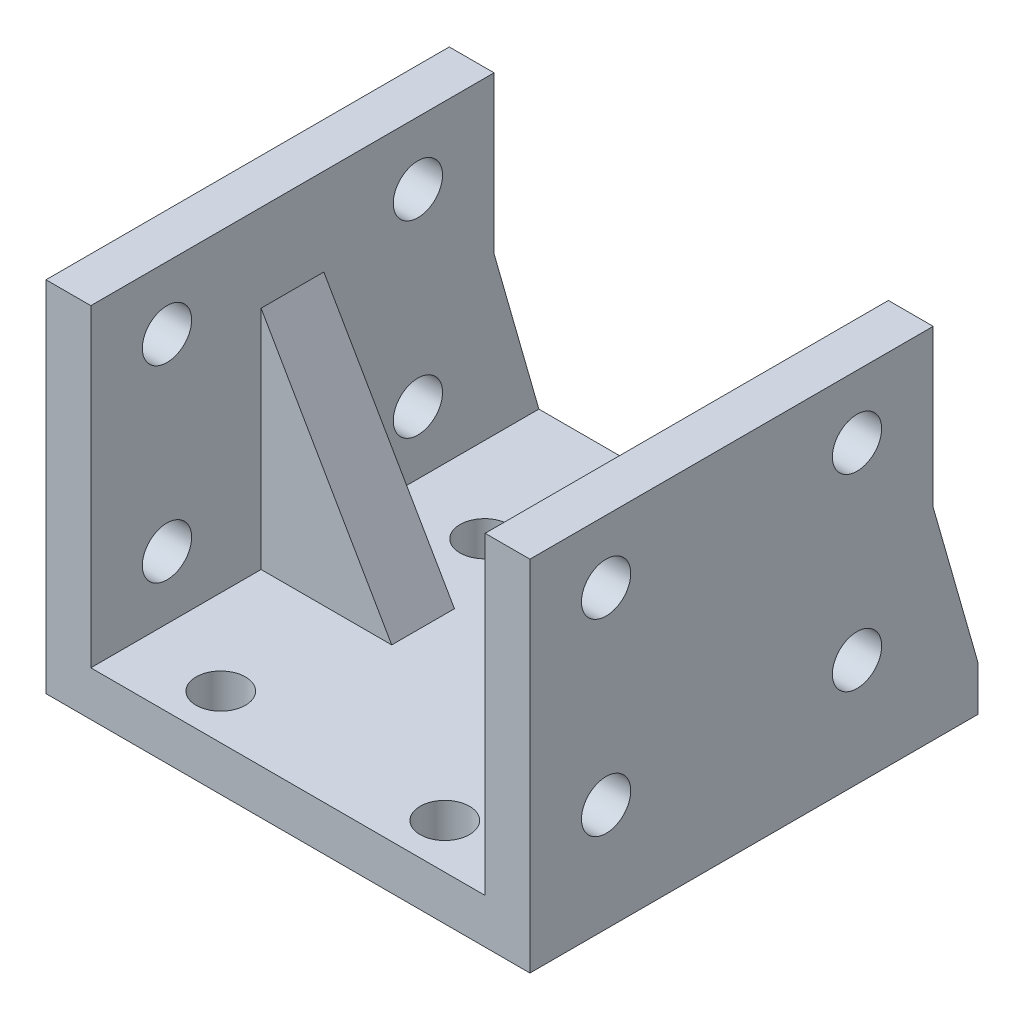
ISO-10303-21;
HEADER;
FILE_DESCRIPTION(('STEP AP214'),'2;1');
FILE_NAME('part.step','',(''),(''),'','','');
FILE_SCHEMA(('AUTOMOTIVE_DESIGN { 1 0 10303 214 1 1 1 1 }'));
ENDSEC;
DATA;
#1=APPLICATION_CONTEXT('core data for automotive mechanical design processes');
#2=APPLICATION_PROTOCOL_DEFINITION('international standard','automotive_design',2000,#1);
#3=PRODUCT_CONTEXT('',#1,'mechanical');
#4=PRODUCT('Part','Part','',(#3));
#5=PRODUCT_RELATED_PRODUCT_CATEGORY('part','',(#4));
#6=PRODUCT_DEFINITION_FORMATION('','',#4);
#7=PRODUCT_DEFINITION_CONTEXT('part definition',#1,'design');
#8=PRODUCT_DEFINITION('design','',#6,#7);
#9=PRODUCT_DEFINITION_SHAPE('','',#8);
#10=(LENGTH_UNIT() NAMED_UNIT(*) SI_UNIT(.MILLI.,.METRE.));
#11=(NAMED_UNIT(*) PLANE_ANGLE_UNIT() SI_UNIT($,.RADIAN.));
#12=(NAMED_UNIT(*) SI_UNIT($,.STERADIAN.) SOLID_ANGLE_UNIT());
#13=UNCERTAINTY_MEASURE_WITH_UNIT(LENGTH_MEASURE(1.E-05),#10,'distance_accuracy_value','');
#14=(GEOMETRIC_REPRESENTATION_CONTEXT(3) GLOBAL_UNCERTAINTY_ASSIGNED_CONTEXT((#13)) GLOBAL_UNIT_ASSIGNED_CONTEXT((#10,
#11,#12)) REPRESENTATION_CONTEXT('',''));
#15=CARTESIAN_POINT('',(0.,0.,0.));
#16=DIRECTION('',(0.,0.,1.));
#17=DIRECTION('',(1.,0.,0.));
#18=AXIS2_PLACEMENT_3D('',#15,#16,#17);
#19=CARTESIAN_POINT('',(0.,5.,0.));
#20=DIRECTION('',(0.,1.,0.));
#21=DIRECTION('',(0.,0.,1.));
#22=AXIS2_PLACEMENT_3D('',#19,#20,#21);
#23=PLANE('',#22);
#24=DIRECTION('',(-1.,0.,0.));
#25=VECTOR('',#24,1.);
#26=CARTESIAN_POINT('',(0.,5.,22.5));
#27=LINE('',#26,#25);
#28=CARTESIAN_POINT('',(22.,4.99999999999998,22.5));
#29=VERTEX_POINT('',#28);
#30=CARTESIAN_POINT('',(-22.,5.,22.5));
#31=VERTEX_POINT('',#30);
#32=EDGE_CURVE('E180',#29,#31,#27,.T.);
#33=ORIENTED_EDGE('',*,*,#32,.F.);
#34=DIRECTION('',(0.,0.,-1.));
#35=VECTOR('',#34,1.);
#36=CARTESIAN_POINT('',(22.,5.,-22.5));
#37=LINE('',#36,#35);
#38=CARTESIAN_POINT('',(22.,4.99999999999998,3.5));
#39=VERTEX_POINT('',#38);
#40=EDGE_CURVE('E315',#29,#39,#37,.T.);
#41=ORIENTED_EDGE('',*,*,#40,.T.);
#42=DIRECTION('',(1.,0.,0.));
#43=VECTOR('',#42,1.);
#44=CARTESIAN_POINT('',(0.,5.,3.5));
#45=LINE('',#44,#43);
#46=CARTESIAN_POINT('',(7.42190570296203,5.,3.5));
#47=VERTEX_POINT('',#46);
#48=EDGE_CURVE('E243',#47,#39,#45,.T.);
#49=ORIENTED_EDGE('',*,*,#48,.F.);
#50=DIRECTION('',(0.,0.,1.));
#51=VECTOR('',#50,1.);
#52=CARTESIAN_POINT('',(7.42190570296203,5.,0.));
#53=LINE('',#52,#51);
#54=CARTESIAN_POINT('',(7.42190570296203,5.,-3.5));
#55=VERTEX_POINT('',#54);
#56=EDGE_CURVE('E241',#55,#47,#53,.T.);
#57=ORIENTED_EDGE('',*,*,#56,.F.);
#58=DIRECTION('',(1.,0.,0.));
#59=VECTOR('',#58,1.);
#60=CARTESIAN_POINT('',(0.,5.,-3.5));
#61=LINE('',#60,#59);
#62=CARTESIAN_POINT('',(22.,4.99999999999998,-3.5));
#63=VERTEX_POINT('',#62);
#64=EDGE_CURVE('E236',#55,#63,#61,.T.);
#65=ORIENTED_EDGE('',*,*,#64,.T.);
#66=CARTESIAN_POINT('',(22.,4.99999999999998,-27.5));
#67=VERTEX_POINT('',#66);
#68=EDGE_CURVE('E233',#63,#67,#37,.T.);
#69=ORIENTED_EDGE('',*,*,#68,.T.);
#70=DIRECTION('',(-1.,0.,0.));
#71=VECTOR('',#70,1.);
#72=CARTESIAN_POINT('',(-27.,5.,-27.5));
#73=LINE('',#72,#71);
#74=CARTESIAN_POINT('',(-22.,5.,-27.5));
#75=VERTEX_POINT('',#74);
#76=EDGE_CURVE('E188',#67,#75,#73,.T.);
#77=ORIENTED_EDGE('',*,*,#76,.T.);
#78=DIRECTION('',(0.,0.,-1.));
#79=VECTOR('',#78,1.);
#80=CARTESIAN_POINT('',(-22.,5.,-22.5));
#81=LINE('',#80,#79);
#82=CARTESIAN_POINT('',(-22.,5.,-3.50000000000001));
#83=VERTEX_POINT('',#82);
#84=EDGE_CURVE('E385',#83,#75,#81,.T.);
#85=ORIENTED_EDGE('',*,*,#84,.F.);
#86=DIRECTION('',(1.,0.,0.));
#87=VECTOR('',#86,1.);
#88=CARTESIAN_POINT('',(0.,5.,-3.5));
#89=LINE('',#88,#87);
#90=CARTESIAN_POINT('',(-7.42190570296203,5.,-3.5));
#91=VERTEX_POINT('',#90);
#92=EDGE_CURVE('E259',#83,#91,#89,.T.);
#93=ORIENTED_EDGE('',*,*,#92,.T.);
#94=DIRECTION('',(0.,0.,1.));
#95=VECTOR('',#94,1.);
#96=CARTESIAN_POINT('',(-7.42190570296203,5.,0.));
#97=LINE('',#96,#95);
#98=CARTESIAN_POINT('',(-7.42190570296203,5.,3.5));
#99=VERTEX_POINT('',#98);
#100=EDGE_CURVE('E62',#99,#91,#97,.F.);
#101=ORIENTED_EDGE('',*,*,#100,.F.);
#102=DIRECTION('',(1.,0.,0.));
#103=VECTOR('',#102,1.);
#104=CARTESIAN_POINT('',(0.,5.,3.5));
#105=LINE('',#104,#103);
#106=CARTESIAN_POINT('',(-22.,5.,3.49999999999999));
#107=VERTEX_POINT('',#106);
#108=EDGE_CURVE('E265',#107,#99,#105,.T.);
#109=ORIENTED_EDGE('',*,*,#108,.F.);
#110=EDGE_CURVE('E392',#31,#107,#81,.T.);
#111=ORIENTED_EDGE('',*,*,#110,.F.);
#112=EDGE_LOOP('',(#33,#41,#49,#57,#65,#69,#77,#85,#93,#101,#109,#111));
#113=FACE_BOUND('',#112,.T.);
#114=CARTESIAN_POINT('',(-12.5,5.,-11.9432112265549));
#115=DIRECTION('',(0.,1.,0.));
#116=DIRECTION('',(0.,0.,1.));
#117=AXIS2_PLACEMENT_3D('',#114,#115,#116);
#118=CIRCLE('',#117,2.75);
#119=CARTESIAN_POINT('',(-12.5,5.,-9.19321122655494));
#120=VERTEX_POINT('',#119);
#121=EDGE_CURVE('E437',#120,#120,#118,.T.);
#122=ORIENTED_EDGE('',*,*,#121,.F.);
#123=EDGE_LOOP('',(#122));
#124=FACE_BOUND('',#123,.T.);
#125=CARTESIAN_POINT('',(-12.5,5.,17.5));
#126=DIRECTION('',(0.,1.,0.));
#127=DIRECTION('',(0.,0.,1.));
#128=AXIS2_PLACEMENT_3D('',#125,#126,#127);
#129=CIRCLE('',#128,2.75);
#130=CARTESIAN_POINT('',(-12.5,5.,20.25));
#131=VERTEX_POINT('',#130);
#132=EDGE_CURVE('E772',#131,#131,#129,.T.);
#133=ORIENTED_EDGE('',*,*,#132,.F.);
#134=EDGE_LOOP('',(#133));
#135=FACE_BOUND('',#134,.T.);
#136=CARTESIAN_POINT('',(12.5,5.,17.5));
#137=DIRECTION('',(0.,1.,0.));
#138=DIRECTION('',(0.,0.,1.));
#139=AXIS2_PLACEMENT_3D('',#136,#137,#138);
#140=CIRCLE('',#139,2.75);
#141=CARTESIAN_POINT('',(12.5,5.,20.25));
#142=VERTEX_POINT('',#141);
#143=EDGE_CURVE('E788',#142,#142,#140,.T.);
#144=ORIENTED_EDGE('',*,*,#143,.F.);
#145=EDGE_LOOP('',(#144));
#146=FACE_BOUND('',#145,.T.);
#147=CARTESIAN_POINT('',(12.5,5.,-11.9432112265549));
#148=DIRECTION('',(0.,1.,0.));
#149=DIRECTION('',(0.,0.,1.));
#150=AXIS2_PLACEMENT_3D('',#147,#148,#149);
#151=CIRCLE('',#150,2.75);
#152=CARTESIAN_POINT('',(12.5,5.,-9.19321122655494));
#153=VERTEX_POINT('',#152);
#154=EDGE_CURVE('E780',#153,#153,#151,.T.);
#155=ORIENTED_EDGE('',*,*,#154,.F.);
#156=EDGE_LOOP('',(#155));
#157=FACE_BOUND('',#156,.T.);
#158=ADVANCED_FACE('F38',(#113,#124,#135,#146,#157),#23,.T.);
#159=CARTESIAN_POINT('',(27.,5.,-27.5));
#160=DIRECTION('',(-1.,0.,0.));
#161=DIRECTION('',(0.,0.,1.));
#162=AXIS2_PLACEMENT_3D('',#159,#160,#161);
#163=PLANE('',#162);
#164=DIRECTION('',(0.,-1.,0.));
#165=VECTOR('',#164,1.);
#166=CARTESIAN_POINT('',(27.,40.,22.5));
#167=LINE('',#166,#165);
#168=CARTESIAN_POINT('',(27.,40.,22.5));
#169=VERTEX_POINT('',#168);
#170=CARTESIAN_POINT('',(27.,0.,22.5));
#171=VERTEX_POINT('',#170);
#172=EDGE_CURVE('E326',#169,#171,#167,.T.);
#173=ORIENTED_EDGE('',*,*,#172,.T.);
#174=DIRECTION('',(0.,0.,-1.));
#175=VECTOR('',#174,1.);
#176=CARTESIAN_POINT('',(27.,0.,-27.5));
#177=LINE('',#176,#175);
#178=CARTESIAN_POINT('',(27.,0.,-27.5));
#179=VERTEX_POINT('',#178);
#180=EDGE_CURVE('E171',#171,#179,#177,.T.);
#181=ORIENTED_EDGE('',*,*,#180,.T.);
#182=DIRECTION('',(0.,-1.,0.));
#183=VECTOR('',#182,1.);
#184=CARTESIAN_POINT('',(27.,5.,-27.5));
#185=LINE('',#184,#183);
#186=CARTESIAN_POINT('',(27.,4.99999999999998,-27.5));
#187=VERTEX_POINT('',#186);
#188=EDGE_CURVE('E201',#187,#179,#185,.T.);
#189=ORIENTED_EDGE('',*,*,#188,.F.);
#190=DIRECTION('',(0.,-0.961523947640823,-0.274721127897378));
#191=VECTOR('',#190,1.);
#192=CARTESIAN_POINT('',(27.,22.5,-22.5));
#193=LINE('',#192,#191);
#194=CARTESIAN_POINT('',(27.,22.5,-22.5));
#195=VERTEX_POINT('',#194);
#196=EDGE_CURVE('E271',#195,#187,#193,.T.);
#197=ORIENTED_EDGE('',*,*,#196,.F.);
#198=DIRECTION('',(0.,-1.,0.));
#199=VECTOR('',#198,1.);
#200=CARTESIAN_POINT('',(27.,40.,-22.5));
#201=LINE('',#200,#199);
#202=CARTESIAN_POINT('',(27.,40.,-22.5));
#203=VERTEX_POINT('',#202);
#204=EDGE_CURVE('E338',#203,#195,#201,.T.);
#205=ORIENTED_EDGE('',*,*,#204,.F.);
#206=DIRECTION('',(0.,0.,1.));
#207=VECTOR('',#206,1.);
#208=CARTESIAN_POINT('',(27.,40.,-22.5));
#209=LINE('',#208,#207);
#210=EDGE_CURVE('E311',#203,#169,#209,.T.);
#211=ORIENTED_EDGE('',*,*,#210,.T.);
#212=EDGE_LOOP('',(#173,#181,#189,#197,#205,#211));
#213=FACE_BOUND('',#212,.T.);
#214=CARTESIAN_POINT('',(27.,33.,14.));
#215=DIRECTION('',(1.,0.,0.));
#216=DIRECTION('',(0.,0.,-1.));
#217=AXIS2_PLACEMENT_3D('',#214,#215,#216);
#218=CIRCLE('',#217,2.75);
#219=CARTESIAN_POINT('',(27.,33.,11.25));
#220=VERTEX_POINT('',#219);
#221=EDGE_CURVE('E304',#220,#220,#218,.T.);
#222=ORIENTED_EDGE('',*,*,#221,.F.);
#223=EDGE_LOOP('',(#222));
#224=FACE_BOUND('',#223,.T.);
#225=CARTESIAN_POINT('',(27.,33.,-14.));
#226=DIRECTION('',(1.,0.,0.));
#227=DIRECTION('',(0.,0.,-1.));
#228=AXIS2_PLACEMENT_3D('',#225,#226,#227);
#229=CIRCLE('',#228,2.75);
#230=CARTESIAN_POINT('',(27.,33.,-16.75));
#231=VERTEX_POINT('',#230);
#232=EDGE_CURVE('E280',#231,#231,#229,.T.);
#233=ORIENTED_EDGE('',*,*,#232,.F.);
#234=EDGE_LOOP('',(#233));
#235=FACE_BOUND('',#234,.T.);
#236=CARTESIAN_POINT('',(27.,12.,-14.));
#237=DIRECTION('',(1.,0.,0.));
#238=DIRECTION('',(0.,0.,-1.));
#239=AXIS2_PLACEMENT_3D('',#236,#237,#238);
#240=CIRCLE('',#239,2.75);
#241=CARTESIAN_POINT('',(27.,12.,-16.75));
#242=VERTEX_POINT('',#241);
#243=EDGE_CURVE('E289',#242,#242,#240,.T.);
#244=ORIENTED_EDGE('',*,*,#243,.F.);
#245=EDGE_LOOP('',(#244));
#246=FACE_BOUND('',#245,.T.);
#247=CARTESIAN_POINT('',(27.,12.,14.));
#248=DIRECTION('',(1.,0.,0.));
#249=DIRECTION('',(0.,0.,-1.));
#250=AXIS2_PLACEMENT_3D('',#247,#248,#249);
#251=CIRCLE('',#250,2.75);
#252=CARTESIAN_POINT('',(27.,12.,11.25));
#253=VERTEX_POINT('',#252);
#254=EDGE_CURVE('E297',#253,#253,#251,.T.);
#255=ORIENTED_EDGE('',*,*,#254,.F.);
#256=EDGE_LOOP('',(#255));
#257=FACE_BOUND('',#256,.T.);
#258=ADVANCED_FACE('F40',(#213,#224,#235,#246,#257),#163,.F.);
#259=CARTESIAN_POINT('',(-27.,5.,-27.5));
#260=DIRECTION('',(0.,0.,1.));
#261=DIRECTION('',(1.,0.,0.));
#262=AXIS2_PLACEMENT_3D('',#259,#260,#261);
#263=PLANE('',#262);
#264=DIRECTION('',(-1.,0.,0.));
#265=VECTOR('',#264,1.);
#266=CARTESIAN_POINT('',(-27.,0.,-27.5));
#267=LINE('',#266,#265);
#268=CARTESIAN_POINT('',(-27.,0.,-27.5));
#269=VERTEX_POINT('',#268);
#270=EDGE_CURVE('E189',#179,#269,#267,.T.);
#271=ORIENTED_EDGE('',*,*,#270,.T.);
#272=DIRECTION('',(0.,-1.,0.));
#273=VECTOR('',#272,1.);
#274=CARTESIAN_POINT('',(-27.,5.,-27.5));
#275=LINE('',#274,#273);
#276=CARTESIAN_POINT('',(-27.,5.,-27.5));
#277=VERTEX_POINT('',#276);
#278=EDGE_CURVE('E186',#277,#269,#275,.T.);
#279=ORIENTED_EDGE('',*,*,#278,.F.);
#280=DIRECTION('',(-1.,0.,0.));
#281=VECTOR('',#280,1.);
#282=CARTESIAN_POINT('',(0.,5.,-27.5));
#283=LINE('',#282,#281);
#284=EDGE_CURVE('E352',#75,#277,#283,.T.);
#285=ORIENTED_EDGE('',*,*,#284,.F.);
#286=ORIENTED_EDGE('',*,*,#76,.F.);
#287=EDGE_CURVE('E194',#187,#67,#73,.T.);
#288=ORIENTED_EDGE('',*,*,#287,.F.);
#289=ORIENTED_EDGE('',*,*,#188,.T.);
#290=EDGE_LOOP('',(#271,#279,#285,#286,#288,#289));
#291=FACE_BOUND('',#290,.T.);
#292=ADVANCED_FACE('F419',(#291),#263,.F.);
#293=CARTESIAN_POINT('',(-27.,5.,-27.5));
#294=DIRECTION('',(1.,0.,0.));
#295=DIRECTION('',(0.,0.,-1.));
#296=AXIS2_PLACEMENT_3D('',#293,#294,#295);
#297=PLANE('',#296);
#298=DIRECTION('',(0.,0.,1.));
#299=VECTOR('',#298,1.);
#300=CARTESIAN_POINT('',(-27.,0.,-27.5));
#301=LINE('',#300,#299);
#302=CARTESIAN_POINT('',(-27.,0.,22.5));
#303=VERTEX_POINT('',#302);
#304=EDGE_CURVE('E178',#269,#303,#301,.T.);
#305=ORIENTED_EDGE('',*,*,#304,.T.);
#306=DIRECTION('',(0.,-1.,0.));
#307=VECTOR('',#306,1.);
#308=CARTESIAN_POINT('',(-27.,40.,22.5));
#309=LINE('',#308,#307);
#310=CARTESIAN_POINT('',(-27.,40.,22.5));
#311=VERTEX_POINT('',#310);
#312=EDGE_CURVE('E159',#311,#303,#309,.T.);
#313=ORIENTED_EDGE('',*,*,#312,.F.);
#314=DIRECTION('',(0.,0.,1.));
#315=VECTOR('',#314,1.);
#316=CARTESIAN_POINT('',(-27.,40.,-22.5));
#317=LINE('',#316,#315);
#318=CARTESIAN_POINT('',(-27.,40.,-22.5));
#319=VERTEX_POINT('',#318);
#320=EDGE_CURVE('E389',#319,#311,#317,.T.);
#321=ORIENTED_EDGE('',*,*,#320,.F.);
#322=DIRECTION('',(0.,-1.,0.));
#323=VECTOR('',#322,1.);
#324=CARTESIAN_POINT('',(-27.,40.,-22.5));
#325=LINE('',#324,#323);
#326=CARTESIAN_POINT('',(-27.,22.5,-22.5));
#327=VERTEX_POINT('',#326);
#328=EDGE_CURVE('E401',#319,#327,#325,.T.);
#329=ORIENTED_EDGE('',*,*,#328,.T.);
#330=DIRECTION('',(0.,-0.961523947640823,-0.274721127897378));
#331=VECTOR('',#330,1.);
#332=CARTESIAN_POINT('',(-27.,22.5,-22.5));
#333=LINE('',#332,#331);
#334=EDGE_CURVE('E343',#327,#277,#333,.T.);
#335=ORIENTED_EDGE('',*,*,#334,.T.);
#336=ORIENTED_EDGE('',*,*,#278,.T.);
#337=EDGE_LOOP('',(#305,#313,#321,#329,#335,#336));
#338=FACE_BOUND('',#337,.T.);
#339=CARTESIAN_POINT('',(-27.,33.,14.));
#340=DIRECTION('',(1.,0.,0.));
#341=DIRECTION('',(0.,0.,-1.));
#342=AXIS2_PLACEMENT_3D('',#339,#340,#341);
#343=CIRCLE('',#342,2.75);
#344=CARTESIAN_POINT('',(-27.,33.,11.25));
#345=VERTEX_POINT('',#344);
#346=EDGE_CURVE('E381',#345,#345,#343,.T.);
#347=ORIENTED_EDGE('',*,*,#346,.T.);
#348=EDGE_LOOP('',(#347));
#349=FACE_BOUND('',#348,.T.);
#350=CARTESIAN_POINT('',(-27.,33.,-14.));
#351=DIRECTION('',(1.,0.,0.));
#352=DIRECTION('',(0.,0.,-1.));
#353=AXIS2_PLACEMENT_3D('',#350,#351,#352);
#354=CIRCLE('',#353,2.75);
#355=CARTESIAN_POINT('',(-27.,33.,-16.75));
#356=VERTEX_POINT('',#355);
#357=EDGE_CURVE('E357',#356,#356,#354,.T.);
#358=ORIENTED_EDGE('',*,*,#357,.T.);
#359=EDGE_LOOP('',(#358));
#360=FACE_BOUND('',#359,.T.);
#361=CARTESIAN_POINT('',(-27.,12.,-14.));
#362=DIRECTION('',(1.,0.,0.));
#363=DIRECTION('',(0.,0.,-1.));
#364=AXIS2_PLACEMENT_3D('',#361,#362,#363);
#365=CIRCLE('',#364,2.75);
#366=CARTESIAN_POINT('',(-27.,12.,-16.75));
#367=VERTEX_POINT('',#366);
#368=EDGE_CURVE('E366',#367,#367,#365,.T.);
#369=ORIENTED_EDGE('',*,*,#368,.T.);
#370=EDGE_LOOP('',(#369));
#371=FACE_BOUND('',#370,.T.);
#372=CARTESIAN_POINT('',(-27.,12.,14.));
#373=DIRECTION('',(1.,0.,0.));
#374=DIRECTION('',(0.,0.,-1.));
#375=AXIS2_PLACEMENT_3D('',#372,#373,#374);
#376=CIRCLE('',#375,2.75);
#377=CARTESIAN_POINT('',(-27.,12.,11.25));
#378=VERTEX_POINT('',#377);
#379=EDGE_CURVE('E374',#378,#378,#376,.T.);
#380=ORIENTED_EDGE('',*,*,#379,.T.);
#381=EDGE_LOOP('',(#380));
#382=FACE_BOUND('',#381,.T.);
#383=ADVANCED_FACE('F183',(#338,#349,#360,#371,#382),#297,.F.);
#384=CARTESIAN_POINT('',(0.,0.,0.));
#385=DIRECTION('',(0.,1.,0.));
#386=DIRECTION('',(0.,0.,1.));
#387=AXIS2_PLACEMENT_3D('',#384,#385,#386);
#388=PLANE('',#387);
#389=CARTESIAN_POINT('',(-12.5,0.,-11.9432112265549));
#390=DIRECTION('',(0.,1.,0.));
#391=DIRECTION('',(0.,0.,1.));
#392=AXIS2_PLACEMENT_3D('',#389,#390,#391);
#393=CIRCLE('',#392,2.75);
#394=CARTESIAN_POINT('',(-12.5,0.,-9.19321122655494));
#395=VERTEX_POINT('',#394);
#396=EDGE_CURVE('E766',#395,#395,#393,.T.);
#397=ORIENTED_EDGE('',*,*,#396,.T.);
#398=EDGE_LOOP('',(#397));
#399=FACE_BOUND('',#398,.T.);
#400=CARTESIAN_POINT('',(-12.5,0.,17.5));
#401=DIRECTION('',(0.,1.,0.));
#402=DIRECTION('',(0.,0.,1.));
#403=AXIS2_PLACEMENT_3D('',#400,#401,#402);
#404=CIRCLE('',#403,2.75);
#405=CARTESIAN_POINT('',(-12.5,0.,20.25));
#406=VERTEX_POINT('',#405);
#407=EDGE_CURVE('E794',#406,#406,#404,.T.);
#408=ORIENTED_EDGE('',*,*,#407,.T.);
#409=EDGE_LOOP('',(#408));
#410=FACE_BOUND('',#409,.T.);
#411=CARTESIAN_POINT('',(12.5,0.,17.5));
#412=DIRECTION('',(0.,1.,0.));
#413=DIRECTION('',(0.,0.,1.));
#414=AXIS2_PLACEMENT_3D('',#411,#412,#413);
#415=CIRCLE('',#414,2.75);
#416=CARTESIAN_POINT('',(12.5,0.,20.25));
#417=VERTEX_POINT('',#416);
#418=EDGE_CURVE('E783',#417,#417,#415,.T.);
#419=ORIENTED_EDGE('',*,*,#418,.T.);
#420=EDGE_LOOP('',(#419));
#421=FACE_BOUND('',#420,.T.);
#422=CARTESIAN_POINT('',(12.5,0.,-11.9432112265549));
#423=DIRECTION('',(0.,1.,0.));
#424=DIRECTION('',(0.,0.,1.));
#425=AXIS2_PLACEMENT_3D('',#422,#423,#424);
#426=CIRCLE('',#425,2.75);
#427=CARTESIAN_POINT('',(12.5,0.,-9.19321122655494));
#428=VERTEX_POINT('',#427);
#429=EDGE_CURVE('E776',#428,#428,#426,.T.);
#430=ORIENTED_EDGE('',*,*,#429,.T.);
#431=EDGE_LOOP('',(#430));
#432=FACE_BOUND('',#431,.T.);
#433=ORIENTED_EDGE('',*,*,#180,.F.);
#434=DIRECTION('',(1.,0.,0.));
#435=VECTOR('',#434,1.);
#436=CARTESIAN_POINT('',(-27.,0.,22.5));
#437=LINE('',#436,#435);
#438=EDGE_CURVE('E163',#303,#171,#437,.T.);
#439=ORIENTED_EDGE('',*,*,#438,.F.);
#440=ORIENTED_EDGE('',*,*,#304,.F.);
#441=ORIENTED_EDGE('',*,*,#270,.F.);
#442=EDGE_LOOP('',(#433,#439,#440,#441));
#443=FACE_BOUND('',#442,.T.);
#444=ADVANCED_FACE('F176',(#399,#410,#421,#432,#443),#388,.F.);
#445=CARTESIAN_POINT('',(-27.,40.,22.5));
#446=DIRECTION('',(0.,0.,-1.));
#447=DIRECTION('',(-1.,0.,0.));
#448=AXIS2_PLACEMENT_3D('',#445,#446,#447);
#449=PLANE('',#448);
#450=ORIENTED_EDGE('',*,*,#312,.T.);
#451=ORIENTED_EDGE('',*,*,#438,.T.);
#452=ORIENTED_EDGE('',*,*,#172,.F.);
#453=DIRECTION('',(-1.,0.,0.));
#454=VECTOR('',#453,1.);
#455=CARTESIAN_POINT('',(27.,40.,22.5));
#456=LINE('',#455,#454);
#457=CARTESIAN_POINT('',(22.,40.,22.5));
#458=VERTEX_POINT('',#457);
#459=EDGE_CURVE('E322',#169,#458,#456,.T.);
#460=ORIENTED_EDGE('',*,*,#459,.T.);
#461=DIRECTION('',(0.,-1.,0.));
#462=VECTOR('',#461,1.);
#463=CARTESIAN_POINT('',(22.,40.,22.5));
#464=LINE('',#463,#462);
#465=EDGE_CURVE('E331',#458,#29,#464,.T.);
#466=ORIENTED_EDGE('',*,*,#465,.T.);
#467=ORIENTED_EDGE('',*,*,#32,.T.);
#468=DIRECTION('',(0.,-1.,0.));
#469=VECTOR('',#468,1.);
#470=CARTESIAN_POINT('',(-22.,40.,22.5));
#471=LINE('',#470,#469);
#472=CARTESIAN_POINT('',(-22.,40.,22.5));
#473=VERTEX_POINT('',#472);
#474=EDGE_CURVE('E172',#473,#31,#471,.T.);
#475=ORIENTED_EDGE('',*,*,#474,.F.);
#476=DIRECTION('',(1.,0.,0.));
#477=VECTOR('',#476,1.);
#478=CARTESIAN_POINT('',(-27.,40.,22.5));
#479=LINE('',#478,#477);
#480=EDGE_CURVE('E166',#311,#473,#479,.T.);
#481=ORIENTED_EDGE('',*,*,#480,.F.);
#482=EDGE_LOOP('',(#450,#451,#452,#460,#466,#467,#475,#481));
#483=FACE_BOUND('',#482,.T.);
#484=ADVANCED_FACE('F161',(#483),#449,.F.);
#485=CARTESIAN_POINT('',(-22.,40.,-22.5));
#486=DIRECTION('',(-1.,0.,0.));
#487=DIRECTION('',(0.,0.,1.));
#488=AXIS2_PLACEMENT_3D('',#485,#486,#487);
#489=PLANE('',#488);
#490=ORIENTED_EDGE('',*,*,#474,.T.);
#491=ORIENTED_EDGE('',*,*,#110,.T.);
#492=DIRECTION('',(0.,1.,0.));
#493=VECTOR('',#492,1.);
#494=CARTESIAN_POINT('',(-22.,40.,3.5));
#495=LINE('',#494,#493);
#496=CARTESIAN_POINT('',(-22.,30.25,3.5));
#497=VERTEX_POINT('',#496);
#498=EDGE_CURVE('E212',#107,#497,#495,.T.);
#499=ORIENTED_EDGE('',*,*,#498,.T.);
#500=DIRECTION('',(0.,0.,1.));
#501=VECTOR('',#500,1.);
#502=CARTESIAN_POINT('',(-22.,30.25,-22.5));
#503=LINE('',#502,#501);
#504=CARTESIAN_POINT('',(-22.,30.25,-3.5));
#505=VERTEX_POINT('',#504);
#506=EDGE_CURVE('E209',#497,#505,#503,.F.);
#507=ORIENTED_EDGE('',*,*,#506,.T.);
#508=DIRECTION('',(0.,1.,0.));
#509=VECTOR('',#508,1.);
#510=CARTESIAN_POINT('',(-22.,40.,-3.5));
#511=LINE('',#510,#509);
#512=EDGE_CURVE('E205',#83,#505,#511,.T.);
#513=ORIENTED_EDGE('',*,*,#512,.F.);
#514=ORIENTED_EDGE('',*,*,#84,.T.);
#515=DIRECTION('',(0.,-0.961523947640823,-0.274721127897378));
#516=VECTOR('',#515,1.);
#517=CARTESIAN_POINT('',(-22.,22.5,-22.5));
#518=LINE('',#517,#516);
#519=CARTESIAN_POINT('',(-22.,22.5,-22.5));
#520=VERTEX_POINT('',#519);
#521=EDGE_CURVE('E342',#520,#75,#518,.T.);
#522=ORIENTED_EDGE('',*,*,#521,.F.);
#523=DIRECTION('',(0.,-1.,0.));
#524=VECTOR('',#523,1.);
#525=CARTESIAN_POINT('',(-22.,40.,-22.5));
#526=LINE('',#525,#524);
#527=CARTESIAN_POINT('',(-22.,40.,-22.5));
#528=VERTEX_POINT('',#527);
#529=EDGE_CURVE('E407',#528,#520,#526,.T.);
#530=ORIENTED_EDGE('',*,*,#529,.F.);
#531=DIRECTION('',(0.,0.,-1.));
#532=VECTOR('',#531,1.);
#533=CARTESIAN_POINT('',(-22.,40.,-22.5));
#534=LINE('',#533,#532);
#535=EDGE_CURVE('E395',#473,#528,#534,.T.);
#536=ORIENTED_EDGE('',*,*,#535,.F.);
#537=EDGE_LOOP('',(#490,#491,#499,#507,#513,#514,#522,#530,#536));
#538=FACE_BOUND('',#537,.T.);
#539=CARTESIAN_POINT('',(-22.,33.,14.));
#540=DIRECTION('',(1.,0.,0.));
#541=DIRECTION('',(0.,0.,-1.));
#542=AXIS2_PLACEMENT_3D('',#539,#540,#541);
#543=CIRCLE('',#542,2.75);
#544=CARTESIAN_POINT('',(-22.,33.,11.25));
#545=VERTEX_POINT('',#544);
#546=EDGE_CURVE('E361',#545,#545,#543,.T.);
#547=ORIENTED_EDGE('',*,*,#546,.F.);
#548=EDGE_LOOP('',(#547));
#549=FACE_BOUND('',#548,.T.);
#550=CARTESIAN_POINT('',(-22.,33.,-14.));
#551=DIRECTION('',(1.,0.,0.));
#552=DIRECTION('',(0.,0.,-1.));
#553=AXIS2_PLACEMENT_3D('',#550,#551,#552);
#554=CIRCLE('',#553,2.75);
#555=CARTESIAN_POINT('',(-22.,33.,-16.75));
#556=VERTEX_POINT('',#555);
#557=EDGE_CURVE('E362',#556,#556,#554,.T.);
#558=ORIENTED_EDGE('',*,*,#557,.F.);
#559=EDGE_LOOP('',(#558));
#560=FACE_BOUND('',#559,.T.);
#561=CARTESIAN_POINT('',(-22.,12.,-14.));
#562=DIRECTION('',(1.,0.,0.));
#563=DIRECTION('',(0.,0.,-1.));
#564=AXIS2_PLACEMENT_3D('',#561,#562,#563);
#565=CIRCLE('',#564,2.75);
#566=CARTESIAN_POINT('',(-22.,12.,-16.75));
#567=VERTEX_POINT('',#566);
#568=EDGE_CURVE('E370',#567,#567,#565,.T.);
#569=ORIENTED_EDGE('',*,*,#568,.F.);
#570=EDGE_LOOP('',(#569));
#571=FACE_BOUND('',#570,.T.);
#572=CARTESIAN_POINT('',(-22.,12.,14.));
#573=DIRECTION('',(1.,0.,0.));
#574=DIRECTION('',(0.,0.,-1.));
#575=AXIS2_PLACEMENT_3D('',#572,#573,#574);
#576=CIRCLE('',#575,2.75);
#577=CARTESIAN_POINT('',(-22.,12.,11.25));
#578=VERTEX_POINT('',#577);
#579=EDGE_CURVE('E356',#578,#578,#576,.T.);
#580=ORIENTED_EDGE('',*,*,#579,.F.);
#581=EDGE_LOOP('',(#580));
#582=FACE_BOUND('',#581,.T.);
#583=ADVANCED_FACE('F494',(#538,#549,#560,#571,#582),#489,.F.);
#584=CARTESIAN_POINT('',(-27.,40.,-22.5));
#585=DIRECTION('',(0.,0.,1.));
#586=DIRECTION('',(1.,0.,0.));
#587=AXIS2_PLACEMENT_3D('',#584,#585,#586);
#588=PLANE('',#587);
#589=ORIENTED_EDGE('',*,*,#529,.T.);
#590=DIRECTION('',(-1.,0.,0.));
#591=VECTOR('',#590,1.);
#592=CARTESIAN_POINT('',(-27.,22.5,-22.5));
#593=LINE('',#592,#591);
#594=EDGE_CURVE('E346',#520,#327,#593,.T.);
#595=ORIENTED_EDGE('',*,*,#594,.T.);
#596=ORIENTED_EDGE('',*,*,#328,.F.);
#597=DIRECTION('',(-1.,0.,0.));
#598=VECTOR('',#597,1.);
#599=CARTESIAN_POINT('',(-27.,40.,-22.5));
#600=LINE('',#599,#598);
#601=EDGE_CURVE('E398',#528,#319,#600,.T.);
#602=ORIENTED_EDGE('',*,*,#601,.F.);
#603=EDGE_LOOP('',(#589,#595,#596,#602));
#604=FACE_BOUND('',#603,.T.);
#605=ADVANCED_FACE('F498',(#604),#588,.F.);
#606=CARTESIAN_POINT('',(0.,40.,0.));
#607=DIRECTION('',(0.,1.,0.));
#608=DIRECTION('',(0.,0.,1.));
#609=AXIS2_PLACEMENT_3D('',#606,#607,#608);
#610=PLANE('',#609);
#611=ORIENTED_EDGE('',*,*,#535,.T.);
#612=ORIENTED_EDGE('',*,*,#601,.T.);
#613=ORIENTED_EDGE('',*,*,#320,.T.);
#614=ORIENTED_EDGE('',*,*,#480,.T.);
#615=EDGE_LOOP('',(#611,#612,#613,#614));
#616=FACE_BOUND('',#615,.T.);
#617=ADVANCED_FACE('F509',(#616),#610,.T.);
#618=CARTESIAN_POINT('',(-27.,33.,14.));
#619=DIRECTION('',(1.,0.,0.));
#620=DIRECTION('',(0.,0.,-1.));
#621=AXIS2_PLACEMENT_3D('',#618,#619,#620);
#622=CYLINDRICAL_SURFACE('',#621,2.75);
#623=ORIENTED_EDGE('',*,*,#346,.F.);
#624=EDGE_LOOP('',(#623));
#625=FACE_BOUND('',#624,.T.);
#626=ORIENTED_EDGE('',*,*,#546,.T.);
#627=EDGE_LOOP('',(#626));
#628=FACE_BOUND('',#627,.T.);
#629=ADVANCED_FACE('F518',(#625,#628),#622,.F.);
#630=CARTESIAN_POINT('',(-27.,33.,-14.));
#631=DIRECTION('',(1.,0.,0.));
#632=DIRECTION('',(0.,0.,-1.));
#633=AXIS2_PLACEMENT_3D('',#630,#631,#632);
#634=CYLINDRICAL_SURFACE('',#633,2.75);
#635=ORIENTED_EDGE('',*,*,#357,.F.);
#636=EDGE_LOOP('',(#635));
#637=FACE_BOUND('',#636,.T.);
#638=ORIENTED_EDGE('',*,*,#557,.T.);
#639=EDGE_LOOP('',(#638));
#640=FACE_BOUND('',#639,.T.);
#641=ADVANCED_FACE('F526',(#637,#640),#634,.F.);
#642=CARTESIAN_POINT('',(-27.,12.,-14.));
#643=DIRECTION('',(1.,0.,0.));
#644=DIRECTION('',(0.,0.,-1.));
#645=AXIS2_PLACEMENT_3D('',#642,#643,#644);
#646=CYLINDRICAL_SURFACE('',#645,2.75);
#647=ORIENTED_EDGE('',*,*,#368,.F.);
#648=EDGE_LOOP('',(#647));
#649=FACE_BOUND('',#648,.T.);
#650=ORIENTED_EDGE('',*,*,#568,.T.);
#651=EDGE_LOOP('',(#650));
#652=FACE_BOUND('',#651,.T.);
#653=ADVANCED_FACE('F534',(#649,#652),#646,.F.);
#654=CARTESIAN_POINT('',(-27.,12.,14.));
#655=DIRECTION('',(1.,0.,0.));
#656=DIRECTION('',(0.,0.,-1.));
#657=AXIS2_PLACEMENT_3D('',#654,#655,#656);
#658=CYLINDRICAL_SURFACE('',#657,2.75);
#659=ORIENTED_EDGE('',*,*,#379,.F.);
#660=EDGE_LOOP('',(#659));
#661=FACE_BOUND('',#660,.T.);
#662=ORIENTED_EDGE('',*,*,#579,.T.);
#663=EDGE_LOOP('',(#662));
#664=FACE_BOUND('',#663,.T.);
#665=ADVANCED_FACE('F542',(#661,#664),#658,.F.);
#666=CARTESIAN_POINT('',(-27.,22.5,-22.5));
#667=DIRECTION('',(0.,0.274721127897378,-0.961523947640823));
#668=DIRECTION('',(0.,-0.961523947640823,-0.274721127897378));
#669=AXIS2_PLACEMENT_3D('',#666,#667,#668);
#670=PLANE('',#669);
#671=ORIENTED_EDGE('',*,*,#521,.T.);
#672=ORIENTED_EDGE('',*,*,#284,.T.);
#673=ORIENTED_EDGE('',*,*,#334,.F.);
#674=ORIENTED_EDGE('',*,*,#594,.F.);
#675=EDGE_LOOP('',(#671,#672,#673,#674));
#676=FACE_BOUND('',#675,.T.);
#677=ADVANCED_FACE('F549',(#676),#670,.T.);
#678=CARTESIAN_POINT('',(27.,40.,-22.5));
#679=DIRECTION('',(0.,0.,-1.));
#680=DIRECTION('',(-1.,0.,0.));
#681=AXIS2_PLACEMENT_3D('',#678,#679,#680);
#682=PLANE('',#681);
#683=DIRECTION('',(-1.,0.,0.));
#684=VECTOR('',#683,1.);
#685=CARTESIAN_POINT('',(27.,22.5,-22.5));
#686=LINE('',#685,#684);
#687=CARTESIAN_POINT('',(22.,22.5,-22.5));
#688=VERTEX_POINT('',#687);
#689=EDGE_CURVE('E274',#688,#195,#686,.F.);
#690=ORIENTED_EDGE('',*,*,#689,.F.);
#691=DIRECTION('',(0.,-1.,0.));
#692=VECTOR('',#691,1.);
#693=CARTESIAN_POINT('',(22.,40.,-22.5));
#694=LINE('',#693,#692);
#695=CARTESIAN_POINT('',(22.,40.,-22.5));
#696=VERTEX_POINT('',#695);
#697=EDGE_CURVE('E334',#696,#688,#694,.T.);
#698=ORIENTED_EDGE('',*,*,#697,.F.);
#699=DIRECTION('',(1.,0.,0.));
#700=VECTOR('',#699,1.);
#701=CARTESIAN_POINT('',(27.,40.,-22.5));
#702=LINE('',#701,#700);
#703=EDGE_CURVE('E314',#696,#203,#702,.T.);
#704=ORIENTED_EDGE('',*,*,#703,.T.);
#705=ORIENTED_EDGE('',*,*,#204,.T.);
#706=EDGE_LOOP('',(#690,#698,#704,#705));
#707=FACE_BOUND('',#706,.T.);
#708=ADVANCED_FACE('F429',(#707),#682,.T.);
#709=CARTESIAN_POINT('',(22.,40.,-22.5));
#710=DIRECTION('',(-1.,0.,0.));
#711=DIRECTION('',(0.,0.,1.));
#712=AXIS2_PLACEMENT_3D('',#709,#710,#711);
#713=PLANE('',#712);
#714=ORIENTED_EDGE('',*,*,#40,.F.);
#715=ORIENTED_EDGE('',*,*,#465,.F.);
#716=DIRECTION('',(0.,0.,-1.));
#717=VECTOR('',#716,1.);
#718=CARTESIAN_POINT('',(22.,40.,-22.5));
#719=LINE('',#718,#717);
#720=EDGE_CURVE('E319',#458,#696,#719,.T.);
#721=ORIENTED_EDGE('',*,*,#720,.T.);
#722=ORIENTED_EDGE('',*,*,#697,.T.);
#723=DIRECTION('',(0.,-0.961523947640823,-0.274721127897378));
#724=VECTOR('',#723,1.);
#725=CARTESIAN_POINT('',(22.,22.5,-22.5));
#726=LINE('',#725,#724);
#727=EDGE_CURVE('E270',#688,#67,#726,.T.);
#728=ORIENTED_EDGE('',*,*,#727,.T.);
#729=ORIENTED_EDGE('',*,*,#68,.F.);
#730=DIRECTION('',(0.,1.,0.));
#731=VECTOR('',#730,1.);
#732=CARTESIAN_POINT('',(22.,40.,-3.5));
#733=LINE('',#732,#731);
#734=CARTESIAN_POINT('',(22.,30.25,-3.5));
#735=VERTEX_POINT('',#734);
#736=EDGE_CURVE('E215',#63,#735,#733,.T.);
#737=ORIENTED_EDGE('',*,*,#736,.T.);
#738=DIRECTION('',(0.,0.,-1.));
#739=VECTOR('',#738,1.);
#740=CARTESIAN_POINT('',(22.,30.25,-22.5));
#741=LINE('',#740,#739);
#742=CARTESIAN_POINT('',(22.,30.25,3.5));
#743=VERTEX_POINT('',#742);
#744=EDGE_CURVE('E47',#743,#735,#741,.T.);
#745=ORIENTED_EDGE('',*,*,#744,.F.);
#746=DIRECTION('',(0.,1.,0.));
#747=VECTOR('',#746,1.);
#748=CARTESIAN_POINT('',(22.,40.,3.5));
#749=LINE('',#748,#747);
#750=EDGE_CURVE('E11',#39,#743,#749,.T.);
#751=ORIENTED_EDGE('',*,*,#750,.F.);
#752=EDGE_LOOP('',(#714,#715,#721,#722,#728,#729,#737,#745,#751));
#753=FACE_BOUND('',#752,.T.);
#754=CARTESIAN_POINT('',(22.,12.,14.));
#755=DIRECTION('',(1.,0.,0.));
#756=DIRECTION('',(0.,0.,-1.));
#757=AXIS2_PLACEMENT_3D('',#754,#755,#756);
#758=CIRCLE('',#757,2.75);
#759=CARTESIAN_POINT('',(22.,12.,11.25));
#760=VERTEX_POINT('',#759);
#761=EDGE_CURVE('E279',#760,#760,#758,.T.);
#762=ORIENTED_EDGE('',*,*,#761,.T.);
#763=EDGE_LOOP('',(#762));
#764=FACE_BOUND('',#763,.T.);
#765=CARTESIAN_POINT('',(22.,12.,-14.));
#766=DIRECTION('',(1.,0.,0.));
#767=DIRECTION('',(0.,0.,-1.));
#768=AXIS2_PLACEMENT_3D('',#765,#766,#767);
#769=CIRCLE('',#768,2.75);
#770=CARTESIAN_POINT('',(22.,12.,-16.75));
#771=VERTEX_POINT('',#770);
#772=EDGE_CURVE('E293',#771,#771,#769,.T.);
#773=ORIENTED_EDGE('',*,*,#772,.T.);
#774=EDGE_LOOP('',(#773));
#775=FACE_BOUND('',#774,.T.);
#776=CARTESIAN_POINT('',(22.,33.,-14.));
#777=DIRECTION('',(1.,0.,0.));
#778=DIRECTION('',(0.,0.,-1.));
#779=AXIS2_PLACEMENT_3D('',#776,#777,#778);
#780=CIRCLE('',#779,2.75);
#781=CARTESIAN_POINT('',(22.,33.,-16.75));
#782=VERTEX_POINT('',#781);
#783=EDGE_CURVE('E285',#782,#782,#780,.T.);
#784=ORIENTED_EDGE('',*,*,#783,.T.);
#785=EDGE_LOOP('',(#784));
#786=FACE_BOUND('',#785,.T.);
#787=CARTESIAN_POINT('',(22.,33.,14.));
#788=DIRECTION('',(1.,0.,0.));
#789=DIRECTION('',(0.,0.,-1.));
#790=AXIS2_PLACEMENT_3D('',#787,#788,#789);
#791=CIRCLE('',#790,2.75);
#792=CARTESIAN_POINT('',(22.,33.,11.25));
#793=VERTEX_POINT('',#792);
#794=EDGE_CURVE('E284',#793,#793,#791,.T.);
#795=ORIENTED_EDGE('',*,*,#794,.T.);
#796=EDGE_LOOP('',(#795));
#797=FACE_BOUND('',#796,.T.);
#798=ADVANCED_FACE('F230',(#753,#764,#775,#786,#797),#713,.T.);
#799=CARTESIAN_POINT('',(0.,40.,0.));
#800=DIRECTION('',(0.,1.,0.));
#801=DIRECTION('',(0.,0.,1.));
#802=AXIS2_PLACEMENT_3D('',#799,#800,#801);
#803=PLANE('',#802);
#804=ORIENTED_EDGE('',*,*,#459,.F.);
#805=ORIENTED_EDGE('',*,*,#210,.F.);
#806=ORIENTED_EDGE('',*,*,#703,.F.);
#807=ORIENTED_EDGE('',*,*,#720,.F.);
#808=EDGE_LOOP('',(#804,#805,#806,#807));
#809=FACE_BOUND('',#808,.T.);
#810=ADVANCED_FACE('F433',(#809),#803,.T.);
#811=CARTESIAN_POINT('',(27.,33.,14.));
#812=DIRECTION('',(-1.,0.,0.));
#813=DIRECTION('',(0.,0.,1.));
#814=AXIS2_PLACEMENT_3D('',#811,#812,#813);
#815=CYLINDRICAL_SURFACE('',#814,2.75);
#816=ORIENTED_EDGE('',*,*,#221,.T.);
#817=EDGE_LOOP('',(#816));
#818=FACE_BOUND('',#817,.T.);
#819=ORIENTED_EDGE('',*,*,#794,.F.);
#820=EDGE_LOOP('',(#819));
#821=FACE_BOUND('',#820,.T.);
#822=ADVANCED_FACE('F576',(#818,#821),#815,.F.);
#823=CARTESIAN_POINT('',(27.,33.,-14.));
#824=DIRECTION('',(-1.,0.,0.));
#825=DIRECTION('',(0.,0.,1.));
#826=AXIS2_PLACEMENT_3D('',#823,#824,#825);
#827=CYLINDRICAL_SURFACE('',#826,2.75);
#828=ORIENTED_EDGE('',*,*,#232,.T.);
#829=EDGE_LOOP('',(#828));
#830=FACE_BOUND('',#829,.T.);
#831=ORIENTED_EDGE('',*,*,#783,.F.);
#832=EDGE_LOOP('',(#831));
#833=FACE_BOUND('',#832,.T.);
#834=ADVANCED_FACE('F583',(#830,#833),#827,.F.);
#835=CARTESIAN_POINT('',(27.,12.,-14.));
#836=DIRECTION('',(-1.,0.,0.));
#837=DIRECTION('',(0.,0.,1.));
#838=AXIS2_PLACEMENT_3D('',#835,#836,#837);
#839=CYLINDRICAL_SURFACE('',#838,2.75);
#840=ORIENTED_EDGE('',*,*,#243,.T.);
#841=EDGE_LOOP('',(#840));
#842=FACE_BOUND('',#841,.T.);
#843=ORIENTED_EDGE('',*,*,#772,.F.);
#844=EDGE_LOOP('',(#843));
#845=FACE_BOUND('',#844,.T.);
#846=ADVANCED_FACE('F591',(#842,#845),#839,.F.);
#847=CARTESIAN_POINT('',(27.,12.,14.));
#848=DIRECTION('',(-1.,0.,0.));
#849=DIRECTION('',(0.,0.,1.));
#850=AXIS2_PLACEMENT_3D('',#847,#848,#849);
#851=CYLINDRICAL_SURFACE('',#850,2.75);
#852=ORIENTED_EDGE('',*,*,#254,.T.);
#853=EDGE_LOOP('',(#852));
#854=FACE_BOUND('',#853,.T.);
#855=ORIENTED_EDGE('',*,*,#761,.F.);
#856=EDGE_LOOP('',(#855));
#857=FACE_BOUND('',#856,.T.);
#858=ADVANCED_FACE('F599',(#854,#857),#851,.F.);
#859=CARTESIAN_POINT('',(27.,22.5,-22.5));
#860=DIRECTION('',(0.,-0.274721127897378,0.961523947640823));
#861=DIRECTION('',(0.,-0.961523947640823,-0.274721127897378));
#862=AXIS2_PLACEMENT_3D('',#859,#860,#861);
#863=PLANE('',#862);
#864=ORIENTED_EDGE('',*,*,#196,.T.);
#865=ORIENTED_EDGE('',*,*,#287,.T.);
#866=ORIENTED_EDGE('',*,*,#727,.F.);
#867=ORIENTED_EDGE('',*,*,#689,.T.);
#868=EDGE_LOOP('',(#864,#865,#866,#867));
#869=FACE_BOUND('',#868,.T.);
#870=ADVANCED_FACE('F423',(#869),#863,.F.);
#871=CARTESIAN_POINT('',(-22.,30.25,0.));
#872=DIRECTION('',(-0.86602540378444,-0.499999999999998,0.));
#873=DIRECTION('',(0.499999999999998,-0.86602540378444,0.));
#874=AXIS2_PLACEMENT_3D('',#871,#872,#873);
#875=PLANE('',#874);
#876=DIRECTION('',(0.499999999999998,-0.86602540378444,0.));
#877=VECTOR('',#876,1.);
#878=CARTESIAN_POINT('',(-22.,30.25,3.5));
#879=LINE('',#878,#877);
#880=EDGE_CURVE('E255',#497,#99,#879,.T.);
#881=ORIENTED_EDGE('',*,*,#880,.T.);
#882=ORIENTED_EDGE('',*,*,#100,.T.);
#883=DIRECTION('',(0.499999999999998,-0.86602540378444,0.));
#884=VECTOR('',#883,1.);
#885=CARTESIAN_POINT('',(-22.,30.25,-3.5));
#886=LINE('',#885,#884);
#887=EDGE_CURVE('E254',#505,#91,#886,.T.);
#888=ORIENTED_EDGE('',*,*,#887,.F.);
#889=ORIENTED_EDGE('',*,*,#506,.F.);
#890=EDGE_LOOP('',(#881,#882,#888,#889));
#891=FACE_BOUND('',#890,.T.);
#892=ADVANCED_FACE('F614',(#891),#875,.F.);
#893=CARTESIAN_POINT('',(0.,20.,3.5));
#894=DIRECTION('',(0.,0.,1.));
#895=DIRECTION('',(1.,0.,0.));
#896=AXIS2_PLACEMENT_3D('',#893,#894,#895);
#897=PLANE('',#896);
#898=ORIENTED_EDGE('',*,*,#498,.F.);
#899=ORIENTED_EDGE('',*,*,#108,.T.);
#900=ORIENTED_EDGE('',*,*,#880,.F.);
#901=EDGE_LOOP('',(#898,#899,#900));
#902=FACE_BOUND('',#901,.T.);
#903=ADVANCED_FACE('F621',(#902),#897,.T.);
#904=CARTESIAN_POINT('',(0.,20.,-3.5));
#905=DIRECTION('',(0.,0.,1.));
#906=DIRECTION('',(1.,0.,0.));
#907=AXIS2_PLACEMENT_3D('',#904,#905,#906);
#908=PLANE('',#907);
#909=ORIENTED_EDGE('',*,*,#92,.F.);
#910=ORIENTED_EDGE('',*,*,#512,.T.);
#911=ORIENTED_EDGE('',*,*,#887,.T.);
#912=EDGE_LOOP('',(#909,#910,#911));
#913=FACE_BOUND('',#912,.T.);
#914=ADVANCED_FACE('F449',(#913),#908,.F.);
#915=CARTESIAN_POINT('',(22.,30.25,0.));
#916=DIRECTION('',(-0.86602540378444,0.499999999999998,0.));
#917=DIRECTION('',(-0.499999999999998,-0.86602540378444,0.));
#918=AXIS2_PLACEMENT_3D('',#915,#916,#917);
#919=PLANE('',#918);
#920=DIRECTION('',(-0.499999999999998,-0.86602540378444,0.));
#921=VECTOR('',#920,1.);
#922=CARTESIAN_POINT('',(22.,30.25,-3.5));
#923=LINE('',#922,#921);
#924=EDGE_CURVE('E54',#735,#55,#923,.T.);
#925=ORIENTED_EDGE('',*,*,#924,.T.);
#926=ORIENTED_EDGE('',*,*,#56,.T.);
#927=DIRECTION('',(-0.499999999999998,-0.86602540378444,0.));
#928=VECTOR('',#927,1.);
#929=CARTESIAN_POINT('',(22.,30.25,3.5));
#930=LINE('',#929,#928);
#931=EDGE_CURVE('E225',#743,#47,#930,.T.);
#932=ORIENTED_EDGE('',*,*,#931,.F.);
#933=ORIENTED_EDGE('',*,*,#744,.T.);
#934=EDGE_LOOP('',(#925,#926,#932,#933));
#935=FACE_BOUND('',#934,.T.);
#936=ADVANCED_FACE('F222',(#935),#919,.T.);
#937=CARTESIAN_POINT('',(0.,20.,3.5));
#938=DIRECTION('',(0.,0.,1.));
#939=DIRECTION('',(1.,0.,0.));
#940=AXIS2_PLACEMENT_3D('',#937,#938,#939);
#941=PLANE('',#940);
#942=ORIENTED_EDGE('',*,*,#931,.T.);
#943=ORIENTED_EDGE('',*,*,#48,.T.);
#944=ORIENTED_EDGE('',*,*,#750,.T.);
#945=EDGE_LOOP('',(#942,#943,#944));
#946=FACE_BOUND('',#945,.T.);
#947=ADVANCED_FACE('F440',(#946),#941,.T.);
#948=CARTESIAN_POINT('',(0.,20.,-3.5));
#949=DIRECTION('',(0.,0.,1.));
#950=DIRECTION('',(1.,0.,0.));
#951=AXIS2_PLACEMENT_3D('',#948,#949,#950);
#952=PLANE('',#951);
#953=ORIENTED_EDGE('',*,*,#64,.F.);
#954=ORIENTED_EDGE('',*,*,#924,.F.);
#955=ORIENTED_EDGE('',*,*,#736,.F.);
#956=EDGE_LOOP('',(#953,#954,#955));
#957=FACE_BOUND('',#956,.T.);
#958=ADVANCED_FACE('F235',(#957),#952,.F.);
#959=CARTESIAN_POINT('',(12.5,0.,-11.9432112265549));
#960=DIRECTION('',(0.,1.,0.));
#961=DIRECTION('',(0.,0.,1.));
#962=AXIS2_PLACEMENT_3D('',#959,#960,#961);
#963=CYLINDRICAL_SURFACE('',#962,2.75);
#964=ORIENTED_EDGE('',*,*,#429,.F.);
#965=EDGE_LOOP('',(#964));
#966=FACE_BOUND('',#965,.T.);
#967=ORIENTED_EDGE('',*,*,#154,.T.);
#968=EDGE_LOOP('',(#967));
#969=FACE_BOUND('',#968,.T.);
#970=ADVANCED_FACE('F447',(#966,#969),#963,.F.);
#971=CARTESIAN_POINT('',(12.5,0.,17.5));
#972=DIRECTION('',(0.,1.,0.));
#973=DIRECTION('',(0.,0.,1.));
#974=AXIS2_PLACEMENT_3D('',#971,#972,#973);
#975=CYLINDRICAL_SURFACE('',#974,2.75);
#976=ORIENTED_EDGE('',*,*,#418,.F.);
#977=EDGE_LOOP('',(#976));
#978=FACE_BOUND('',#977,.T.);
#979=ORIENTED_EDGE('',*,*,#143,.T.);
#980=EDGE_LOOP('',(#979));
#981=FACE_BOUND('',#980,.T.);
#982=ADVANCED_FACE('F659',(#978,#981),#975,.F.);
#983=CARTESIAN_POINT('',(-12.5,0.,17.5));
#984=DIRECTION('',(0.,1.,0.));
#985=DIRECTION('',(0.,0.,1.));
#986=AXIS2_PLACEMENT_3D('',#983,#984,#985);
#987=CYLINDRICAL_SURFACE('',#986,2.75);
#988=ORIENTED_EDGE('',*,*,#407,.F.);
#989=EDGE_LOOP('',(#988));
#990=FACE_BOUND('',#989,.T.);
#991=ORIENTED_EDGE('',*,*,#132,.T.);
#992=EDGE_LOOP('',(#991));
#993=FACE_BOUND('',#992,.T.);
#994=ADVANCED_FACE('F668',(#990,#993),#987,.F.);
#995=CARTESIAN_POINT('',(-12.5,0.,-11.9432112265549));
#996=DIRECTION('',(0.,1.,0.));
#997=DIRECTION('',(0.,0.,1.));
#998=AXIS2_PLACEMENT_3D('',#995,#996,#997);
#999=CYLINDRICAL_SURFACE('',#998,2.75);
#1000=ORIENTED_EDGE('',*,*,#396,.F.);
#1001=EDGE_LOOP('',(#1000));
#1002=FACE_BOUND('',#1001,.T.);
#1003=ORIENTED_EDGE('',*,*,#121,.T.);
#1004=EDGE_LOOP('',(#1003));
#1005=FACE_BOUND('',#1004,.T.);
#1006=ADVANCED_FACE('F677',(#1002,#1005),#999,.F.);
#1007=CLOSED_SHELL('',(#158,#258,#292,#383,#444,#484,#583,#605,#617,#629,#641,#653,#665,#677,
#708,#798,#810,#822,#834,#846,#858,#870,#892,#903,#914,#936,#947,#958,#970,#982,#994,#1006));
#1008=MANIFOLD_SOLID_BREP('B2',#1007);
#1009=ADVANCED_BREP_SHAPE_REPRESENTATION('',(#18,#1008),#14);
#1010=SHAPE_DEFINITION_REPRESENTATION(#9,#1009);
ENDSEC;
END-ISO-10303-21;
